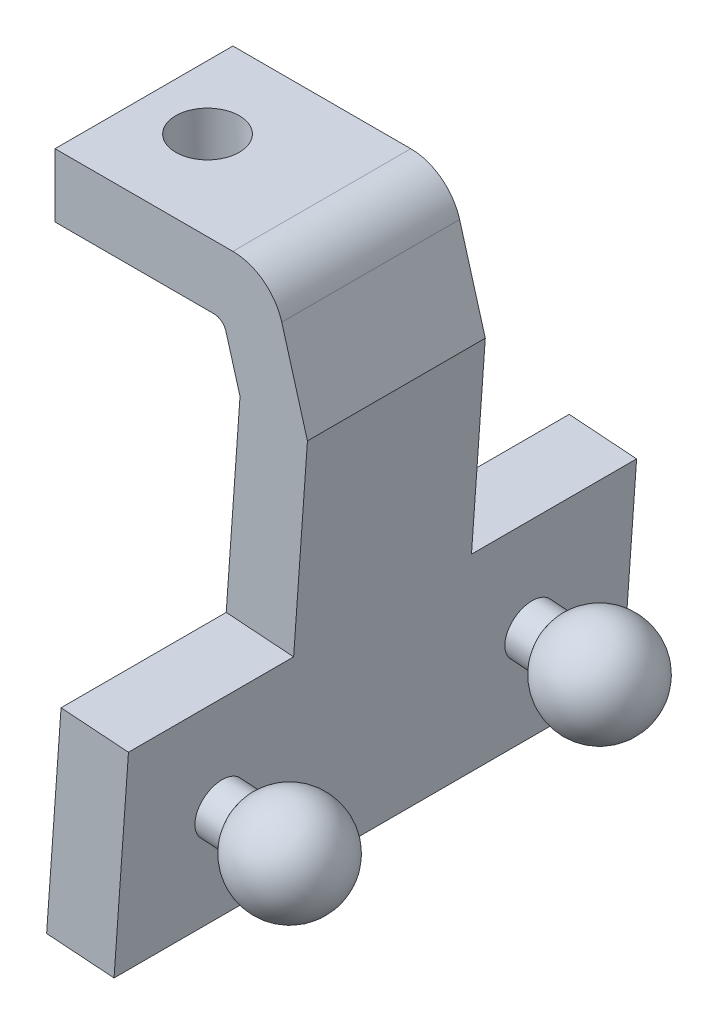
ISO-10303-21;
HEADER;
FILE_DESCRIPTION(('STEP AP214'),'2;1');
FILE_NAME('part.step','',(''),(''),'','','');
FILE_SCHEMA(('AUTOMOTIVE_DESIGN { 1 0 10303 214 1 1 1 1 }'));
ENDSEC;
DATA;
#1=APPLICATION_CONTEXT('core data for automotive mechanical design processes');
#2=APPLICATION_PROTOCOL_DEFINITION('international standard','automotive_design',2000,#1);
#3=PRODUCT_CONTEXT('',#1,'mechanical');
#4=PRODUCT('Part','Part','',(#3));
#5=PRODUCT_RELATED_PRODUCT_CATEGORY('part','',(#4));
#6=PRODUCT_DEFINITION_FORMATION('','',#4);
#7=PRODUCT_DEFINITION_CONTEXT('part definition',#1,'design');
#8=PRODUCT_DEFINITION('design','',#6,#7);
#9=PRODUCT_DEFINITION_SHAPE('','',#8);
#10=(LENGTH_UNIT() NAMED_UNIT(*) SI_UNIT(.MILLI.,.METRE.));
#11=(NAMED_UNIT(*) PLANE_ANGLE_UNIT() SI_UNIT($,.RADIAN.));
#12=(NAMED_UNIT(*) SI_UNIT($,.STERADIAN.) SOLID_ANGLE_UNIT());
#13=UNCERTAINTY_MEASURE_WITH_UNIT(LENGTH_MEASURE(1.E-05),#10,'distance_accuracy_value','');
#14=(GEOMETRIC_REPRESENTATION_CONTEXT(3) GLOBAL_UNCERTAINTY_ASSIGNED_CONTEXT((#13)) GLOBAL_UNIT_ASSIGNED_CONTEXT((#10,
#11,#12)) REPRESENTATION_CONTEXT('',''));
#15=CARTESIAN_POINT('',(0.,0.,0.));
#16=DIRECTION('',(0.,0.,1.));
#17=DIRECTION('',(1.,0.,0.));
#18=AXIS2_PLACEMENT_3D('',#15,#16,#17);
#19=CARTESIAN_POINT('',(0.,0.,3.5));
#20=DIRECTION('',(1.,0.,0.));
#21=DIRECTION('',(0.,0.,-1.));
#22=AXIS2_PLACEMENT_3D('',#19,#20,#21);
#23=PLANE('',#22);
#24=DIRECTION('',(0.,-1.,0.));
#25=VECTOR('',#24,1.);
#26=CARTESIAN_POINT('',(0.,0.,-3.5));
#27=LINE('',#26,#25);
#28=CARTESIAN_POINT('',(0.,2.5,-3.5));
#29=VERTEX_POINT('',#28);
#30=CARTESIAN_POINT('',(0.,0.,-3.5));
#31=VERTEX_POINT('',#30);
#32=EDGE_CURVE('E212',#29,#31,#27,.T.);
#33=ORIENTED_EDGE('',*,*,#32,.T.);
#34=DIRECTION('',(0.,0.,-1.));
#35=VECTOR('',#34,1.);
#36=CARTESIAN_POINT('',(0.,0.,3.5));
#37=LINE('',#36,#35);
#38=CARTESIAN_POINT('',(0.,0.,3.5));
#39=VERTEX_POINT('',#38);
#40=EDGE_CURVE('E252',#39,#31,#37,.T.);
#41=ORIENTED_EDGE('',*,*,#40,.F.);
#42=DIRECTION('',(0.,-1.,0.));
#43=VECTOR('',#42,1.);
#44=CARTESIAN_POINT('',(0.,0.,3.5));
#45=LINE('',#44,#43);
#46=CARTESIAN_POINT('',(0.,2.5,3.5));
#47=VERTEX_POINT('',#46);
#48=EDGE_CURVE('E192',#47,#39,#45,.T.);
#49=ORIENTED_EDGE('',*,*,#48,.F.);
#50=DIRECTION('',(0.,0.,-1.));
#51=VECTOR('',#50,1.);
#52=CARTESIAN_POINT('',(0.,2.5,3.5));
#53=LINE('',#52,#51);
#54=EDGE_CURVE('E211',#47,#29,#53,.T.);
#55=ORIENTED_EDGE('',*,*,#54,.T.);
#56=EDGE_LOOP('',(#33,#41,#49,#55));
#57=FACE_BOUND('',#56,.T.);
#58=ADVANCED_FACE('F41',(#57),#23,.F.);
#59=CARTESIAN_POINT('',(0.,0.,3.5));
#60=DIRECTION('',(0.,1.,0.));
#61=DIRECTION('',(0.,0.,1.));
#62=AXIS2_PLACEMENT_3D('',#59,#60,#61);
#63=PLANE('',#62);
#64=CARTESIAN_POINT('',(2.5,0.,0.));
#65=DIRECTION('',(0.,-1.,0.));
#66=DIRECTION('',(1.,0.,0.));
#67=AXIS2_PLACEMENT_3D('',#64,#65,#66);
#68=CIRCLE('',#67,1.25);
#69=CARTESIAN_POINT('',(3.75,0.,0.));
#70=VERTEX_POINT('',#69);
#71=EDGE_CURVE('E188',#70,#70,#68,.T.);
#72=ORIENTED_EDGE('',*,*,#71,.F.);
#73=EDGE_LOOP('',(#72));
#74=FACE_BOUND('',#73,.T.);
#75=DIRECTION('',(1.,0.,0.));
#76=VECTOR('',#75,1.);
#77=CARTESIAN_POINT('',(0.,0.,-3.5));
#78=LINE('',#77,#76);
#79=CARTESIAN_POINT('',(6.24543275290352,0.,-3.5));
#80=VERTEX_POINT('',#79);
#81=EDGE_CURVE('E215',#31,#80,#78,.T.);
#82=ORIENTED_EDGE('',*,*,#81,.T.);
#83=DIRECTION('',(0.,0.,-1.));
#84=VECTOR('',#83,1.);
#85=CARTESIAN_POINT('',(6.24543275290352,0.,3.5));
#86=LINE('',#85,#84);
#87=CARTESIAN_POINT('',(6.24543275290352,0.,3.5));
#88=VERTEX_POINT('',#87);
#89=EDGE_CURVE('E249',#88,#80,#86,.T.);
#90=ORIENTED_EDGE('',*,*,#89,.F.);
#91=DIRECTION('',(1.,0.,0.));
#92=VECTOR('',#91,1.);
#93=CARTESIAN_POINT('',(0.,0.,3.5));
#94=LINE('',#93,#92);
#95=EDGE_CURVE('E195',#39,#88,#94,.T.);
#96=ORIENTED_EDGE('',*,*,#95,.F.);
#97=ORIENTED_EDGE('',*,*,#40,.T.);
#98=EDGE_LOOP('',(#82,#90,#96,#97));
#99=FACE_BOUND('',#98,.T.);
#100=ADVANCED_FACE('F295',(#74,#99),#63,.F.);
#101=CARTESIAN_POINT('',(6.24543275290367,-0.5,3.5));
#102=DIRECTION('',(0.,0.,-1.));
#103=DIRECTION('',(-1.,0.,0.));
#104=AXIS2_PLACEMENT_3D('',#101,#102,#103);
#105=CYLINDRICAL_SURFACE('',#104,0.499999999999929);
#106=CARTESIAN_POINT('',(6.24543275290367,-0.5,-3.5));
#107=DIRECTION('',(0.,0.,-1.));
#108=DIRECTION('',(-1.,0.,0.));
#109=AXIS2_PLACEMENT_3D('',#106,#107,#108);
#110=CIRCLE('',#109,0.499999999999929);
#111=CARTESIAN_POINT('',(6.72624123981867,-0.362802336352114,-3.5));
#112=VERTEX_POINT('',#111);
#113=EDGE_CURVE('E217',#80,#112,#110,.T.);
#114=ORIENTED_EDGE('',*,*,#113,.T.);
#115=DIRECTION('',(0.,0.,-1.));
#116=VECTOR('',#115,1.);
#117=CARTESIAN_POINT('',(6.72624123981867,-0.362802336352114,3.5));
#118=LINE('',#117,#116);
#119=CARTESIAN_POINT('',(6.72624123981867,-0.362802336352114,3.5));
#120=VERTEX_POINT('',#119);
#121=EDGE_CURVE('E246',#120,#112,#118,.T.);
#122=ORIENTED_EDGE('',*,*,#121,.F.);
#123=CARTESIAN_POINT('',(6.24543275290367,-0.5,3.5));
#124=DIRECTION('',(0.,0.,-1.));
#125=DIRECTION('',(-1.,0.,0.));
#126=AXIS2_PLACEMENT_3D('',#123,#124,#125);
#127=CIRCLE('',#126,0.499999999999929);
#128=EDGE_CURVE('E198',#88,#120,#127,.T.);
#129=ORIENTED_EDGE('',*,*,#128,.F.);
#130=ORIENTED_EDGE('',*,*,#89,.T.);
#131=EDGE_LOOP('',(#114,#122,#129,#130));
#132=FACE_BOUND('',#131,.T.);
#133=ADVANCED_FACE('F291',(#132),#105,.F.);
#134=CARTESIAN_POINT('',(6.7262412398186,-0.362802336352133,3.5));
#135=DIRECTION('',(0.961616973830157,0.274395327295732,0.));
#136=DIRECTION('',(-0.274395327295732,0.961616973830157,0.));
#137=AXIS2_PLACEMENT_3D('',#134,#135,#136);
#138=PLANE('',#137);
#139=DIRECTION('',(0.274395327295732,-0.961616973830156,0.));
#140=VECTOR('',#139,1.);
#141=CARTESIAN_POINT('',(6.7262412398186,-0.362802336352133,-3.5));
#142=LINE('',#141,#140);
#143=CARTESIAN_POINT('',(7.28017081267278,-2.30404559589561,-3.5));
#144=VERTEX_POINT('',#143);
#145=EDGE_CURVE('E219',#112,#144,#142,.T.);
#146=ORIENTED_EDGE('',*,*,#145,.T.);
#147=DIRECTION('',(0.,0.,-1.));
#148=VECTOR('',#147,1.);
#149=CARTESIAN_POINT('',(7.28017081267278,-2.30404559589561,3.5));
#150=LINE('',#149,#148);
#151=CARTESIAN_POINT('',(7.28017081267278,-2.30404559589561,3.5));
#152=VERTEX_POINT('',#151);
#153=EDGE_CURVE('E244',#152,#144,#150,.T.);
#154=ORIENTED_EDGE('',*,*,#153,.F.);
#155=DIRECTION('',(0.274395327295732,-0.961616973830156,0.));
#156=VECTOR('',#155,1.);
#157=CARTESIAN_POINT('',(6.7262412398186,-0.362802336352133,3.5));
#158=LINE('',#157,#156);
#159=EDGE_CURVE('E200',#120,#152,#158,.T.);
#160=ORIENTED_EDGE('',*,*,#159,.F.);
#161=ORIENTED_EDGE('',*,*,#121,.T.);
#162=EDGE_LOOP('',(#146,#154,#160,#161));
#163=FACE_BOUND('',#162,.T.);
#164=ADVANCED_FACE('F286',(#163),#138,.F.);
#165=CARTESIAN_POINT('',(7.28017081267278,-2.30404559589561,3.5));
#166=DIRECTION('',(0.997473103500255,-0.0710451109758392,0.));
#167=DIRECTION('',(0.0710451109758392,0.997473103500255,0.));
#168=AXIS2_PLACEMENT_3D('',#165,#166,#167);
#169=PLANE('',#168);
#170=DIRECTION('',(-0.0710451109758392,-0.997473103500255,0.));
#171=VECTOR('',#170,1.);
#172=CARTESIAN_POINT('',(7.28017081267278,-2.30404559589561,-3.5));
#173=LINE('',#172,#171);
#174=CARTESIAN_POINT('',(6.73647267286429,-9.93756553038508,-3.5));
#175=VERTEX_POINT('',#174);
#176=EDGE_CURVE('E159',#144,#175,#173,.T.);
#177=ORIENTED_EDGE('',*,*,#176,.T.);
#178=DIRECTION('',(0.,0.,1.));
#179=VECTOR('',#178,1.);
#180=CARTESIAN_POINT('',(6.73647267286429,-9.93756553038508,10.));
#181=LINE('',#180,#179);
#182=CARTESIAN_POINT('',(6.73647267286429,-9.93756553038508,-10.));
#183=VERTEX_POINT('',#182);
#184=EDGE_CURVE('E144',#183,#175,#181,.T.);
#185=ORIENTED_EDGE('',*,*,#184,.F.);
#186=DIRECTION('',(0.071045110975839,0.997473103500255,0.));
#187=VECTOR('',#186,1.);
#188=CARTESIAN_POINT('',(6.73647267286429,-9.93756553038508,-10.));
#189=LINE('',#188,#187);
#190=CARTESIAN_POINT('',(6.16811178505758,-17.9173503583871,-10.));
#191=VERTEX_POINT('',#190);
#192=EDGE_CURVE('E156',#191,#183,#189,.T.);
#193=ORIENTED_EDGE('',*,*,#192,.F.);
#194=DIRECTION('',(0.,0.,-1.));
#195=VECTOR('',#194,1.);
#196=CARTESIAN_POINT('',(6.16811178505758,-17.9173503583871,3.5));
#197=LINE('',#196,#195);
#198=CARTESIAN_POINT('',(6.16811178505758,-17.9173503583871,9.99999999999999));
#199=VERTEX_POINT('',#198);
#200=EDGE_CURVE('E242',#199,#191,#197,.T.);
#201=ORIENTED_EDGE('',*,*,#200,.F.);
#202=DIRECTION('',(-0.071045110975839,-0.997473103500255,0.));
#203=VECTOR('',#202,1.);
#204=CARTESIAN_POINT('',(6.73647267286429,-9.93756553038508,10.));
#205=LINE('',#204,#203);
#206=CARTESIAN_POINT('',(6.73647267286429,-9.93756553038508,10.));
#207=VERTEX_POINT('',#206);
#208=EDGE_CURVE('E150',#207,#199,#205,.T.);
#209=ORIENTED_EDGE('',*,*,#208,.F.);
#210=CARTESIAN_POINT('',(6.73647267286429,-9.93756553038508,3.5));
#211=VERTEX_POINT('',#210);
#212=EDGE_CURVE('E160',#211,#207,#181,.T.);
#213=ORIENTED_EDGE('',*,*,#212,.F.);
#214=DIRECTION('',(-0.0710451109758392,-0.997473103500255,0.));
#215=VECTOR('',#214,1.);
#216=CARTESIAN_POINT('',(7.28017081267278,-2.30404559589561,3.5));
#217=LINE('',#216,#215);
#218=EDGE_CURVE('E55',#152,#211,#217,.T.);
#219=ORIENTED_EDGE('',*,*,#218,.F.);
#220=ORIENTED_EDGE('',*,*,#153,.T.);
#221=EDGE_LOOP('',(#177,#185,#193,#201,#209,#213,#219,#220));
#222=FACE_BOUND('',#221,.T.);
#223=ADVANCED_FACE('F155',(#222),#169,.F.);
#224=CARTESIAN_POINT('',(6.16811178505758,-17.9173503583871,3.5));
#225=DIRECTION('',(0.071045110975839,0.997473103500255,0.));
#226=DIRECTION('',(-0.997473103500255,0.071045110975839,0.));
#227=AXIS2_PLACEMENT_3D('',#224,#225,#226);
#228=PLANE('',#227);
#229=ORIENTED_EDGE('',*,*,#200,.T.);
#230=DIRECTION('',(0.997473103500255,-0.071045110975839,0.));
#231=VECTOR('',#230,1.);
#232=CARTESIAN_POINT('',(6.16811178505758,-17.9173503583871,-10.));
#233=LINE('',#232,#231);
#234=CARTESIAN_POINT('',(8.82183354852642,-18.1063619282461,-10.));
#235=VERTEX_POINT('',#234);
#236=EDGE_CURVE('E165',#191,#235,#233,.T.);
#237=ORIENTED_EDGE('',*,*,#236,.T.);
#238=DIRECTION('',(0.,0.,-1.));
#239=VECTOR('',#238,1.);
#240=CARTESIAN_POINT('',(8.82183354852641,-18.106361928246,3.5));
#241=LINE('',#240,#239);
#242=CARTESIAN_POINT('',(8.82183354852642,-18.1063619282461,9.99999999999999));
#243=VERTEX_POINT('',#242);
#244=EDGE_CURVE('E240',#243,#235,#241,.T.);
#245=ORIENTED_EDGE('',*,*,#244,.F.);
#246=DIRECTION('',(0.997473103500255,-0.071045110975839,0.));
#247=VECTOR('',#246,1.);
#248=CARTESIAN_POINT('',(6.16811178505758,-17.9173503583871,9.99999999999999));
#249=LINE('',#248,#247);
#250=EDGE_CURVE('E182',#199,#243,#249,.T.);
#251=ORIENTED_EDGE('',*,*,#250,.F.);
#252=EDGE_LOOP('',(#229,#237,#245,#251));
#253=FACE_BOUND('',#252,.T.);
#254=ADVANCED_FACE('F282',(#253),#228,.F.);
#255=CARTESIAN_POINT('',(8.82183354852641,-18.106361928246,3.5));
#256=DIRECTION('',(-0.997473103500255,0.071045110975839,0.));
#257=DIRECTION('',(-0.071045110975839,-0.997473103500255,0.));
#258=AXIS2_PLACEMENT_3D('',#255,#256,#257);
#259=PLANE('',#258);
#260=CARTESIAN_POINT('',(9.10601399242977,-14.116469514245,-6.09939540666506));
#261=DIRECTION('',(-0.997473103500255,0.071045110975839,0.));
#262=DIRECTION('',(0.071045110975839,0.997473103500255,0.));
#263=AXIS2_PLACEMENT_3D('',#260,#261,#262);
#264=CIRCLE('',#263,1.);
#265=CARTESIAN_POINT('',(9.17705910340561,-13.1189964107448,-6.09939540666506));
#266=VERTEX_POINT('',#265);
#267=EDGE_CURVE('E341',#266,#266,#264,.T.);
#268=ORIENTED_EDGE('',*,*,#267,.T.);
#269=EDGE_LOOP('',(#268));
#270=FACE_BOUND('',#269,.T.);
#271=CARTESIAN_POINT('',(9.10601399242977,-14.116469514245,6.09939540666506));
#272=DIRECTION('',(-0.997473103500255,0.071045110975839,0.));
#273=DIRECTION('',(-0.071045110975839,-0.997473103500255,0.));
#274=AXIS2_PLACEMENT_3D('',#271,#272,#273);
#275=CIRCLE('',#274,1.);
#276=CARTESIAN_POINT('',(9.03496888145393,-15.1139426177453,6.09939540666506));
#277=VERTEX_POINT('',#276);
#278=EDGE_CURVE('E11',#277,#277,#275,.F.);
#279=ORIENTED_EDGE('',*,*,#278,.F.);
#280=EDGE_LOOP('',(#279));
#281=FACE_BOUND('',#280,.T.);
#282=DIRECTION('',(0.071045110975839,0.997473103500255,0.));
#283=VECTOR('',#282,1.);
#284=CARTESIAN_POINT('',(8.82183354852641,-18.106361928246,3.5));
#285=LINE('',#284,#283);
#286=CARTESIAN_POINT('',(9.39019443633313,-10.126577100244,3.5));
#287=VERTEX_POINT('',#286);
#288=CARTESIAN_POINT('',(9.93389257614161,-2.49305716575454,3.5));
#289=VERTEX_POINT('',#288);
#290=EDGE_CURVE('E203',#287,#289,#285,.T.);
#291=ORIENTED_EDGE('',*,*,#290,.F.);
#292=DIRECTION('',(0.,0.,1.));
#293=VECTOR('',#292,1.);
#294=CARTESIAN_POINT('',(9.39019443633313,-10.126577100244,10.));
#295=LINE('',#294,#293);
#296=CARTESIAN_POINT('',(9.39019443633313,-10.126577100244,10.));
#297=VERTEX_POINT('',#296);
#298=EDGE_CURVE('E178',#287,#297,#295,.T.);
#299=ORIENTED_EDGE('',*,*,#298,.T.);
#300=DIRECTION('',(-0.071045110975839,-0.997473103500255,0.));
#301=VECTOR('',#300,1.);
#302=CARTESIAN_POINT('',(9.39019443633313,-10.126577100244,10.));
#303=LINE('',#302,#301);
#304=EDGE_CURVE('E166',#297,#243,#303,.T.);
#305=ORIENTED_EDGE('',*,*,#304,.T.);
#306=ORIENTED_EDGE('',*,*,#244,.T.);
#307=DIRECTION('',(0.071045110975839,0.997473103500255,0.));
#308=VECTOR('',#307,1.);
#309=CARTESIAN_POINT('',(9.39019443633313,-10.126577100244,-10.));
#310=LINE('',#309,#308);
#311=CARTESIAN_POINT('',(9.39019443633313,-10.126577100244,-10.));
#312=VERTEX_POINT('',#311);
#313=EDGE_CURVE('E176',#235,#312,#310,.T.);
#314=ORIENTED_EDGE('',*,*,#313,.T.);
#315=CARTESIAN_POINT('',(9.39019443633313,-10.126577100244,-3.5));
#316=VERTEX_POINT('',#315);
#317=EDGE_CURVE('E63',#312,#316,#295,.T.);
#318=ORIENTED_EDGE('',*,*,#317,.T.);
#319=DIRECTION('',(0.071045110975839,0.997473103500255,0.));
#320=VECTOR('',#319,1.);
#321=CARTESIAN_POINT('',(8.82183354852641,-18.106361928246,-3.5));
#322=LINE('',#321,#320);
#323=CARTESIAN_POINT('',(9.93389257614161,-2.49305716575454,-3.5));
#324=VERTEX_POINT('',#323);
#325=EDGE_CURVE('E222',#316,#324,#322,.T.);
#326=ORIENTED_EDGE('',*,*,#325,.T.);
#327=DIRECTION('',(0.,0.,-1.));
#328=VECTOR('',#327,1.);
#329=CARTESIAN_POINT('',(9.93389257614161,-2.49305716575454,3.5));
#330=LINE('',#329,#328);
#331=EDGE_CURVE('E237',#289,#324,#330,.T.);
#332=ORIENTED_EDGE('',*,*,#331,.F.);
#333=EDGE_LOOP('',(#291,#299,#305,#306,#314,#318,#326,#332));
#334=FACE_BOUND('',#333,.T.);
#335=ADVANCED_FACE('F263',(#270,#281,#334),#259,.F.);
#336=CARTESIAN_POINT('',(9.93389257614161,-2.49305716575454,3.5));
#337=DIRECTION('',(-0.961616973830156,-0.274395327295733,0.));
#338=DIRECTION('',(0.274395327295734,-0.961616973830156,0.));
#339=AXIS2_PLACEMENT_3D('',#336,#337,#338);
#340=PLANE('',#339);
#341=DIRECTION('',(-0.274395327295733,0.961616973830156,0.));
#342=VECTOR('',#341,1.);
#343=CARTESIAN_POINT('',(9.93389257614161,-2.49305716575454,-3.5));
#344=LINE('',#343,#342);
#345=CARTESIAN_POINT('',(8.92323394766031,1.04879065459147,-3.5));
#346=VERTEX_POINT('',#345);
#347=EDGE_CURVE('E224',#324,#346,#344,.T.);
#348=ORIENTED_EDGE('',*,*,#347,.T.);
#349=DIRECTION('',(0.,0.,-1.));
#350=VECTOR('',#349,1.);
#351=CARTESIAN_POINT('',(8.92323394766031,1.04879065459147,3.5));
#352=LINE('',#351,#350);
#353=CARTESIAN_POINT('',(8.92323394766031,1.04879065459147,3.5));
#354=VERTEX_POINT('',#353);
#355=EDGE_CURVE('E234',#354,#346,#352,.T.);
#356=ORIENTED_EDGE('',*,*,#355,.F.);
#357=DIRECTION('',(-0.274395327295733,0.961616973830156,0.));
#358=VECTOR('',#357,1.);
#359=CARTESIAN_POINT('',(9.93389257614161,-2.49305716575454,3.5));
#360=LINE('',#359,#358);
#361=EDGE_CURVE('E205',#289,#354,#360,.T.);
#362=ORIENTED_EDGE('',*,*,#361,.F.);
#363=ORIENTED_EDGE('',*,*,#331,.T.);
#364=EDGE_LOOP('',(#348,#356,#362,#363));
#365=FACE_BOUND('',#364,.T.);
#366=ADVANCED_FACE('F266',(#365),#340,.F.);
#367=CARTESIAN_POINT('',(7.,0.5,3.5));
#368=DIRECTION('',(0.,0.,-1.));
#369=DIRECTION('',(-1.,0.,0.));
#370=AXIS2_PLACEMENT_3D('',#367,#368,#369);
#371=CYLINDRICAL_SURFACE('',#370,2.);
#372=CARTESIAN_POINT('',(7.,0.5,-3.5));
#373=DIRECTION('',(0.,0.,1.));
#374=DIRECTION('',(1.,0.,0.));
#375=AXIS2_PLACEMENT_3D('',#372,#373,#374);
#376=CIRCLE('',#375,2.);
#377=CARTESIAN_POINT('',(7.,2.5,-3.5));
#378=VERTEX_POINT('',#377);
#379=EDGE_CURVE('E226',#346,#378,#376,.T.);
#380=ORIENTED_EDGE('',*,*,#379,.T.);
#381=DIRECTION('',(0.,0.,-1.));
#382=VECTOR('',#381,1.);
#383=CARTESIAN_POINT('',(7.,2.5,3.5));
#384=LINE('',#383,#382);
#385=CARTESIAN_POINT('',(7.,2.5,3.5));
#386=VERTEX_POINT('',#385);
#387=EDGE_CURVE('E231',#386,#378,#384,.T.);
#388=ORIENTED_EDGE('',*,*,#387,.F.);
#389=CARTESIAN_POINT('',(7.,0.5,3.5));
#390=DIRECTION('',(0.,0.,1.));
#391=DIRECTION('',(1.,0.,0.));
#392=AXIS2_PLACEMENT_3D('',#389,#390,#391);
#393=CIRCLE('',#392,2.);
#394=EDGE_CURVE('E207',#354,#386,#393,.T.);
#395=ORIENTED_EDGE('',*,*,#394,.F.);
#396=ORIENTED_EDGE('',*,*,#355,.T.);
#397=EDGE_LOOP('',(#380,#388,#395,#396));
#398=FACE_BOUND('',#397,.T.);
#399=ADVANCED_FACE('F305',(#398),#371,.T.);
#400=CARTESIAN_POINT('',(0.,2.5,3.5));
#401=DIRECTION('',(0.,-1.,0.));
#402=DIRECTION('',(0.,0.,-1.));
#403=AXIS2_PLACEMENT_3D('',#400,#401,#402);
#404=PLANE('',#403);
#405=CARTESIAN_POINT('',(2.5,2.5,0.));
#406=DIRECTION('',(0.,-1.,0.));
#407=DIRECTION('',(0.,0.,-1.));
#408=AXIS2_PLACEMENT_3D('',#405,#406,#407);
#409=CIRCLE('',#408,1.25);
#410=CARTESIAN_POINT('',(2.5,2.5,-1.25));
#411=VERTEX_POINT('',#410);
#412=EDGE_CURVE('E191',#411,#411,#409,.T.);
#413=ORIENTED_EDGE('',*,*,#412,.T.);
#414=EDGE_LOOP('',(#413));
#415=FACE_BOUND('',#414,.T.);
#416=DIRECTION('',(-1.,0.,0.));
#417=VECTOR('',#416,1.);
#418=CARTESIAN_POINT('',(0.,2.5,-3.5));
#419=LINE('',#418,#417);
#420=EDGE_CURVE('E196',#378,#29,#419,.T.);
#421=ORIENTED_EDGE('',*,*,#420,.T.);
#422=ORIENTED_EDGE('',*,*,#54,.F.);
#423=DIRECTION('',(-1.,0.,0.));
#424=VECTOR('',#423,1.);
#425=CARTESIAN_POINT('',(0.,2.5,3.5));
#426=LINE('',#425,#424);
#427=EDGE_CURVE('E209',#386,#47,#426,.T.);
#428=ORIENTED_EDGE('',*,*,#427,.F.);
#429=ORIENTED_EDGE('',*,*,#387,.T.);
#430=EDGE_LOOP('',(#421,#422,#428,#429));
#431=FACE_BOUND('',#430,.T.);
#432=ADVANCED_FACE('F302',(#415,#431),#404,.F.);
#433=CARTESIAN_POINT('',(7.,0.5,3.5));
#434=DIRECTION('',(0.,0.,1.));
#435=DIRECTION('',(1.,0.,0.));
#436=AXIS2_PLACEMENT_3D('',#433,#434,#435);
#437=PLANE('',#436);
#438=DIRECTION('',(-0.997473103500255,0.071045110975839,0.));
#439=VECTOR('',#438,1.);
#440=CARTESIAN_POINT('',(6.25900565847162,-9.90355789959705,3.5));
#441=LINE('',#440,#439);
#442=EDGE_CURVE('E181',#287,#211,#441,.T.);
#443=ORIENTED_EDGE('',*,*,#442,.F.);
#444=ORIENTED_EDGE('',*,*,#290,.T.);
#445=ORIENTED_EDGE('',*,*,#361,.T.);
#446=ORIENTED_EDGE('',*,*,#394,.T.);
#447=ORIENTED_EDGE('',*,*,#427,.T.);
#448=ORIENTED_EDGE('',*,*,#48,.T.);
#449=ORIENTED_EDGE('',*,*,#95,.T.);
#450=ORIENTED_EDGE('',*,*,#128,.T.);
#451=ORIENTED_EDGE('',*,*,#159,.T.);
#452=ORIENTED_EDGE('',*,*,#218,.T.);
#453=EDGE_LOOP('',(#443,#444,#445,#446,#447,#448,#449,#450,#451,#452));
#454=FACE_BOUND('',#453,.T.);
#455=ADVANCED_FACE('F269',(#454),#437,.T.);
#456=CARTESIAN_POINT('',(7.,0.5,-3.5));
#457=DIRECTION('',(0.,0.,1.));
#458=DIRECTION('',(1.,0.,0.));
#459=AXIS2_PLACEMENT_3D('',#456,#457,#458);
#460=PLANE('',#459);
#461=ORIENTED_EDGE('',*,*,#325,.F.);
#462=DIRECTION('',(-0.997473103500255,0.071045110975839,0.));
#463=VECTOR('',#462,1.);
#464=CARTESIAN_POINT('',(6.25900565847162,-9.90355789959705,-3.5));
#465=LINE('',#464,#463);
#466=EDGE_CURVE('E48',#316,#175,#465,.T.);
#467=ORIENTED_EDGE('',*,*,#466,.T.);
#468=ORIENTED_EDGE('',*,*,#176,.F.);
#469=ORIENTED_EDGE('',*,*,#145,.F.);
#470=ORIENTED_EDGE('',*,*,#113,.F.);
#471=ORIENTED_EDGE('',*,*,#81,.F.);
#472=ORIENTED_EDGE('',*,*,#32,.F.);
#473=ORIENTED_EDGE('',*,*,#420,.F.);
#474=ORIENTED_EDGE('',*,*,#379,.F.);
#475=ORIENTED_EDGE('',*,*,#347,.F.);
#476=EDGE_LOOP('',(#461,#467,#468,#469,#470,#471,#472,#473,#474,#475));
#477=FACE_BOUND('',#476,.T.);
#478=ADVANCED_FACE('F258',(#477),#460,.F.);
#479=CARTESIAN_POINT('',(2.5,5.5,0.));
#480=DIRECTION('',(0.,-1.,0.));
#481=DIRECTION('',(1.,0.,0.));
#482=AXIS2_PLACEMENT_3D('',#479,#480,#481);
#483=CYLINDRICAL_SURFACE('',#482,1.25);
#484=ORIENTED_EDGE('',*,*,#71,.T.);
#485=EDGE_LOOP('',(#484));
#486=FACE_BOUND('',#485,.T.);
#487=ORIENTED_EDGE('',*,*,#412,.F.);
#488=EDGE_LOOP('',(#487));
#489=FACE_BOUND('',#488,.T.);
#490=ADVANCED_FACE('F363',(#486,#489),#483,.F.);
#491=CARTESIAN_POINT('',(6.73647267286429,-9.93756553038508,-10.));
#492=DIRECTION('',(0.,0.,-1.));
#493=DIRECTION('',(0.,1.,0.));
#494=AXIS2_PLACEMENT_3D('',#491,#492,#493);
#495=PLANE('',#494);
#496=ORIENTED_EDGE('',*,*,#313,.F.);
#497=ORIENTED_EDGE('',*,*,#236,.F.);
#498=ORIENTED_EDGE('',*,*,#192,.T.);
#499=DIRECTION('',(0.997473103500255,-0.071045110975839,0.));
#500=VECTOR('',#499,1.);
#501=CARTESIAN_POINT('',(6.73647267286429,-9.93756553038508,-10.));
#502=LINE('',#501,#500);
#503=EDGE_CURVE('E141',#183,#312,#502,.T.);
#504=ORIENTED_EDGE('',*,*,#503,.T.);
#505=EDGE_LOOP('',(#496,#497,#498,#504));
#506=FACE_BOUND('',#505,.T.);
#507=ADVANCED_FACE('F163',(#506),#495,.T.);
#508=CARTESIAN_POINT('',(6.73647267286429,-9.93756553038508,10.));
#509=DIRECTION('',(0.071045110975839,0.997473103500255,0.));
#510=DIRECTION('',(-0.997473103500255,0.071045110975839,0.));
#511=AXIS2_PLACEMENT_3D('',#508,#509,#510);
#512=PLANE('',#511);
#513=ORIENTED_EDGE('',*,*,#466,.F.);
#514=ORIENTED_EDGE('',*,*,#317,.F.);
#515=ORIENTED_EDGE('',*,*,#503,.F.);
#516=ORIENTED_EDGE('',*,*,#184,.T.);
#517=EDGE_LOOP('',(#513,#514,#515,#516));
#518=FACE_BOUND('',#517,.T.);
#519=ADVANCED_FACE('F143',(#518),#512,.T.);
#520=CARTESIAN_POINT('',(6.73647267286429,-9.93756553038508,10.));
#521=DIRECTION('',(0.,0.,1.));
#522=DIRECTION('',(0.,-1.,0.));
#523=AXIS2_PLACEMENT_3D('',#520,#521,#522);
#524=PLANE('',#523);
#525=ORIENTED_EDGE('',*,*,#304,.F.);
#526=DIRECTION('',(0.997473103500255,-0.071045110975839,0.));
#527=VECTOR('',#526,1.);
#528=CARTESIAN_POINT('',(6.73647267286429,-9.93756553038508,10.));
#529=LINE('',#528,#527);
#530=EDGE_CURVE('E149',#207,#297,#529,.T.);
#531=ORIENTED_EDGE('',*,*,#530,.F.);
#532=ORIENTED_EDGE('',*,*,#208,.T.);
#533=ORIENTED_EDGE('',*,*,#250,.T.);
#534=EDGE_LOOP('',(#525,#531,#532,#533));
#535=FACE_BOUND('',#534,.T.);
#536=ADVANCED_FACE('F279',(#535),#524,.T.);
#537=ORIENTED_EDGE('',*,*,#298,.F.);
#538=ORIENTED_EDGE('',*,*,#442,.T.);
#539=ORIENTED_EDGE('',*,*,#212,.T.);
#540=ORIENTED_EDGE('',*,*,#530,.T.);
#541=EDGE_LOOP('',(#537,#538,#539,#540));
#542=FACE_BOUND('',#541,.T.);
#543=ADVANCED_FACE('F275',(#542),#512,.T.);
#544=CARTESIAN_POINT('',(10.10348709593,-14.1875146252209,6.09939540666506));
#545=DIRECTION('',(-0.997473103500255,0.071045110975839,0.));
#546=DIRECTION('',(-0.071045110975839,-0.997473103500255,0.));
#547=AXIS2_PLACEMENT_3D('',#544,#545,#546);
#548=CYLINDRICAL_SURFACE('',#547,1.);
#549=CARTESIAN_POINT('',(10.10348709593,-14.1875146252209,6.09939540666506));
#550=DIRECTION('',(0.997473103500255,-0.071045110975839,0.));
#551=DIRECTION('',(0.071045110975839,0.997473103500255,0.));
#552=AXIS2_PLACEMENT_3D('',#549,#550,#551);
#553=CIRCLE('',#552,1.);
#554=CARTESIAN_POINT('',(10.0324419849542,-15.1849877287211,6.09939540666506));
#555=VERTEX_POINT('',#554);
#556=EDGE_CURVE('E171',#555,#555,#553,.T.);
#557=CARTESIAN_POINT('',(10.0324419849542,-15.1849877287211,6.09939540666506));
#558=CARTESIAN_POINT('',(10.0220516401261,-15.1842476754818,6.09939540666506));
#559=CARTESIAN_POINT('',(10.0116612952979,-15.1835076222425,6.09939540666506));
#560=CARTESIAN_POINT('',(9.99088060564168,-15.1820275157638,6.09939540666506));
#561=CARTESIAN_POINT('',(9.98049026081355,-15.1812874625245,6.09939540666506));
#562=CARTESIAN_POINT('',(9.9597095711573,-15.1798073560458,6.09939540666506));
#563=CARTESIAN_POINT('',(9.94931922632917,-15.1790673028065,6.09939540666506));
#564=CARTESIAN_POINT('',(9.92853853667292,-15.1775871963278,6.09939540666506));
#565=CARTESIAN_POINT('',(9.91814819184479,-15.1768471430885,6.09939540666506));
#566=CARTESIAN_POINT('',(9.89736750218853,-15.1753670366098,6.09939540666506));
#567=CARTESIAN_POINT('',(9.8869771573604,-15.1746269833705,6.09939540666506));
#568=CARTESIAN_POINT('',(9.86619646770415,-15.1731468768918,6.09939540666506));
#569=CARTESIAN_POINT('',(9.85580612287602,-15.1724068236525,6.09939540666506));
#570=CARTESIAN_POINT('',(9.83502543321976,-15.1709267171738,6.09939540666506));
#571=CARTESIAN_POINT('',(9.82463508839164,-15.1701866639345,6.09939540666506));
#572=CARTESIAN_POINT('',(9.80385439873538,-15.1687065574558,6.09939540666506));
#573=CARTESIAN_POINT('',(9.79346405390725,-15.1679665042165,6.09939540666506));
#574=CARTESIAN_POINT('',(9.772683364251,-15.1664863977378,6.09939540666506));
#575=CARTESIAN_POINT('',(9.76229301942287,-15.1657463444985,6.09939540666506));
#576=CARTESIAN_POINT('',(9.74151232976662,-15.1642662380198,6.09939540666506));
#577=CARTESIAN_POINT('',(9.73112198493849,-15.1635261847805,6.09939540666506));
#578=CARTESIAN_POINT('',(9.71034129528223,-15.1620460783018,6.09939540666506));
#579=CARTESIAN_POINT('',(9.6999509504541,-15.1613060250625,6.09939540666506));
#580=CARTESIAN_POINT('',(9.67917026079785,-15.1598259185839,6.09939540666506));
#581=CARTESIAN_POINT('',(9.66877991596972,-15.1590858653445,6.09939540666506));
#582=CARTESIAN_POINT('',(9.64799922631347,-15.1576057588659,6.09939540666506));
#583=CARTESIAN_POINT('',(9.63760888148534,-15.1568657056265,6.09939540666506));
#584=CARTESIAN_POINT('',(9.61682819182908,-15.1553855991479,6.09939540666506));
#585=CARTESIAN_POINT('',(9.60643784700095,-15.1546455459085,6.09939540666506));
#586=CARTESIAN_POINT('',(9.5856571573447,-15.1531654394299,6.09939540666506));
#587=CARTESIAN_POINT('',(9.57526681251657,-15.1524253861905,6.09939540666506));
#588=CARTESIAN_POINT('',(9.55448612286032,-15.1509452797119,6.09939540666506));
#589=CARTESIAN_POINT('',(9.54409577803219,-15.1502052264725,6.09939540666506));
#590=CARTESIAN_POINT('',(9.52331508837593,-15.1487251199939,6.09939540666506));
#591=CARTESIAN_POINT('',(9.51292474354781,-15.1479850667545,6.09939540666506));
#592=CARTESIAN_POINT('',(9.49214405389155,-15.1465049602759,6.09939540666506));
#593=CARTESIAN_POINT('',(9.48175370906342,-15.1457649070366,6.09939540666506));
#594=CARTESIAN_POINT('',(9.46097301940717,-15.1442848005579,6.09939540666506));
#595=CARTESIAN_POINT('',(9.45058267457904,-15.1435447473186,6.09939540666506));
#596=CARTESIAN_POINT('',(9.42980198492278,-15.1420646408399,6.09939540666506));
#597=CARTESIAN_POINT('',(9.41941164009465,-15.1413245876006,6.09939540666506));
#598=CARTESIAN_POINT('',(9.3986309504384,-15.1398444811219,6.09939540666506));
#599=CARTESIAN_POINT('',(9.38824060561027,-15.1391044278826,6.09939540666506));
#600=CARTESIAN_POINT('',(9.36745991595402,-15.1376243214039,6.09939540666506));
#601=CARTESIAN_POINT('',(9.35706957112589,-15.1368842681646,6.09939540666506));
#602=CARTESIAN_POINT('',(9.33628888146963,-15.1354041616859,6.09939540666506));
#603=CARTESIAN_POINT('',(9.32589853664151,-15.1346641084466,6.09939540666506));
#604=CARTESIAN_POINT('',(9.30511784698525,-15.1331840019679,6.09939540666506));
#605=CARTESIAN_POINT('',(9.29472750215712,-15.1324439487286,6.09939540666506));
#606=CARTESIAN_POINT('',(9.27394681250087,-15.1309638422499,6.09939540666506));
#607=CARTESIAN_POINT('',(9.26355646767274,-15.1302237890106,6.09939540666506));
#608=CARTESIAN_POINT('',(9.24277577801648,-15.1287436825319,6.09939540666506));
#609=CARTESIAN_POINT('',(9.23238543318836,-15.1280036292926,6.09939540666506));
#610=CARTESIAN_POINT('',(9.2116047435321,-15.1265235228139,6.09939540666506));
#611=CARTESIAN_POINT('',(9.20121439870397,-15.1257834695746,6.09939540666506));
#612=CARTESIAN_POINT('',(9.18043370904772,-15.1243033630959,6.09939540666506));
#613=CARTESIAN_POINT('',(9.17004336421959,-15.1235633098566,6.09939540666506));
#614=CARTESIAN_POINT('',(9.14926267456333,-15.1220832033779,6.09939540666506));
#615=CARTESIAN_POINT('',(9.13887232973521,-15.1213431501386,6.09939540666506));
#616=CARTESIAN_POINT('',(9.11809164007895,-15.1198630436599,6.09939540666506));
#617=CARTESIAN_POINT('',(9.10770129525082,-15.1191229904206,6.09939540666506));
#618=CARTESIAN_POINT('',(9.08692060559457,-15.1176428839419,6.09939540666506));
#619=CARTESIAN_POINT('',(9.07653026076644,-15.1169028307026,6.09939540666506));
#620=CARTESIAN_POINT('',(9.05574957111019,-15.115422724224,6.09939540666506));
#621=CARTESIAN_POINT('',(9.04535922628206,-15.1146826709846,6.09939540666506));
#622=CARTESIAN_POINT('',(9.03496888145393,-15.1139426177453,6.09939540666506));
#623=B_SPLINE_CURVE_WITH_KNOTS('',3,(#557,#558,#559,#560,#561,#562,#563,#564,#565,#566,#567,
#568,#569,#570,#571,#572,#573,#574,#575,#576,#577,#578,#579,#580,#581,#582,#583,#584,#585,#586,
#587,#588,#589,#590,#591,#592,#593,#594,#595,#596,#597,#598,#599,#600,#601,#602,#603,#604,#605,
#606,#607,#608,#609,#610,#611,#612,#613,#614,#615,#616,#617,#618,#619,#620,#621,#622),
.UNSPECIFIED.,.F.,.F.,(4,2,2,2,2,2,2,2,2,2,2,2,2,2,2,2,2,2,2,2,2,2,2,2,2,2,2,2,2,2,2,2,4),(0.,
0.0312500000000011,0.0625000000000004,0.0937500000000015,0.125000000000001,0.156250000000002,
0.187500000000001,0.218750000000003,0.250000000000002,0.281250000000003,0.312500000000002,
0.343750000000004,0.375000000000003,0.406250000000004,0.437500000000003,0.468750000000005,
0.500000000000004,0.531250000000005,0.562500000000005,0.593750000000006,0.625000000000005,
0.656250000000006,0.687500000000005,0.718750000000007,0.750000000000006,0.781250000000007,
0.812500000000007,0.843750000000008,0.875000000000007,0.906250000000008,0.937500000000008,
0.968750000000009,1.00000000000001),.UNSPECIFIED.);
#624=EDGE_CURVE('BSEAM344',#555,#277,#623,.T.);
#625=ORIENTED_EDGE('',*,*,#556,.F.);
#626=ORIENTED_EDGE('',*,*,#278,.T.);
#627=ORIENTED_EDGE('',*,*,#624,.T.);
#628=ORIENTED_EDGE('',*,*,#624,.F.);
#629=EDGE_LOOP('',(#625,#627,#626,#628));
#630=FACE_BOUND('',#629,.T.);
#631=ADVANCED_FACE('F344',(#630),#548,.T.);
#632=CARTESIAN_POINT('',(11.8311611903759,-14.3105683670604,6.09939540666506));
#633=DIRECTION('',(-0.997473103500255,0.071045110975839,0.));
#634=DIRECTION('',(0.,0.,1.));
#635=AXIS2_PLACEMENT_3D('',#632,#633,#634);
#636=SPHERICAL_SURFACE('',#635,2.);
#637=ORIENTED_EDGE('',*,*,#556,.T.);
#638=EDGE_LOOP('',(#637));
#639=FACE_BOUND('',#638,.T.);
#640=ADVANCED_FACE('F346',(#639),#636,.T.);
#641=CARTESIAN_POINT('',(10.10348709593,-14.1875146252209,-6.09939540666506));
#642=DIRECTION('',(-0.997473103500255,0.071045110975839,0.));
#643=DIRECTION('',(-0.071045110975839,-0.997473103500255,0.));
#644=AXIS2_PLACEMENT_3D('',#641,#642,#643);
#645=CYLINDRICAL_SURFACE('',#644,1.);
#646=CARTESIAN_POINT('',(10.10348709593,-14.1875146252209,-6.09939540666506));
#647=DIRECTION('',(0.997473103500255,-0.071045110975839,0.));
#648=DIRECTION('',(-0.071045110975839,-0.997473103500255,0.));
#649=AXIS2_PLACEMENT_3D('',#646,#647,#648);
#650=CIRCLE('',#649,1.);
#651=CARTESIAN_POINT('',(10.0324419849542,-15.1849877287211,-6.09939540666506));
#652=VERTEX_POINT('',#651);
#653=EDGE_CURVE('E429',#652,#652,#650,.T.);
#654=ORIENTED_EDGE('',*,*,#653,.F.);
#655=EDGE_LOOP('',(#654));
#656=FACE_BOUND('',#655,.T.);
#657=ORIENTED_EDGE('',*,*,#267,.F.);
#658=EDGE_LOOP('',(#657));
#659=FACE_BOUND('',#658,.T.);
#660=ADVANCED_FACE('F352',(#656,#659),#645,.T.);
#661=CARTESIAN_POINT('',(11.8311611903759,-14.3105683670604,-6.09939540666506));
#662=DIRECTION('',(-0.997473103500255,0.071045110975839,0.));
#663=DIRECTION('',(0.,0.,-1.));
#664=AXIS2_PLACEMENT_3D('',#661,#662,#663);
#665=SPHERICAL_SURFACE('',#664,2.);
#666=ORIENTED_EDGE('',*,*,#653,.T.);
#667=EDGE_LOOP('',(#666));
#668=FACE_BOUND('',#667,.T.);
#669=ADVANCED_FACE('F415',(#668),#665,.T.);
#670=CLOSED_SHELL('',(#58,#100,#133,#164,#223,#254,#335,#366,#399,#432,#455,#478,#490,#507,#519,
#536,#543,#631,#640,#660,#669));
#671=MANIFOLD_SOLID_BREP('B2',#670);
#672=ADVANCED_BREP_SHAPE_REPRESENTATION('',(#18,#671),#14);
#673=SHAPE_DEFINITION_REPRESENTATION(#9,#672);
ENDSEC;
END-ISO-10303-21;
